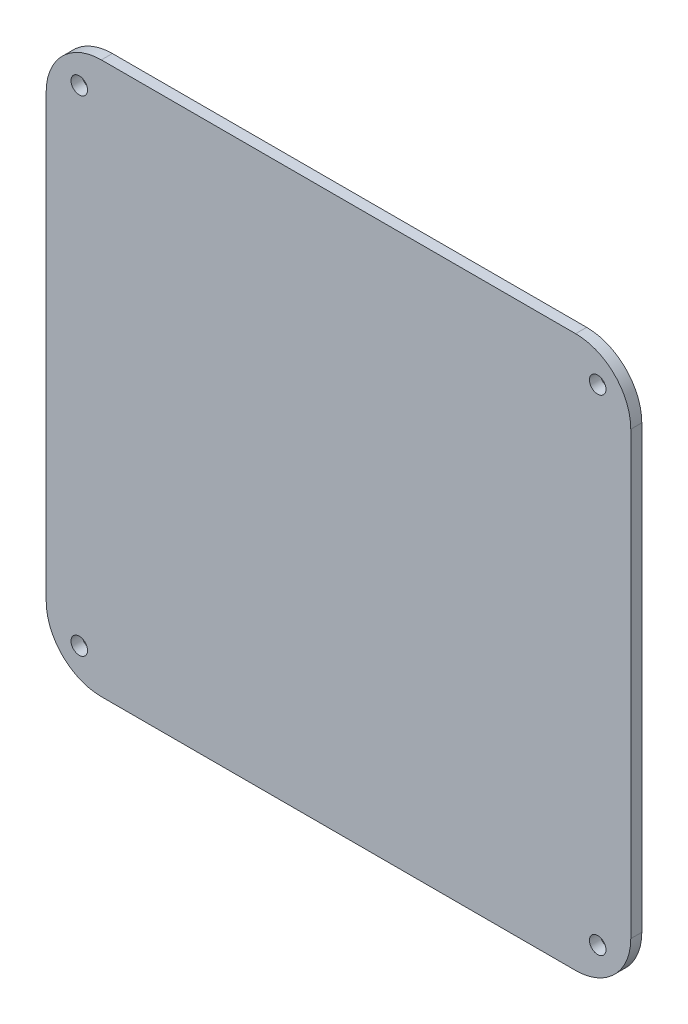
ISO-10303-21;
HEADER;
FILE_DESCRIPTION(('STEP AP214'),'2;1');
FILE_NAME('part.step','',(''),(''),'','','');
FILE_SCHEMA(('AUTOMOTIVE_DESIGN { 1 0 10303 214 1 1 1 1 }'));
ENDSEC;
DATA;
#1=APPLICATION_CONTEXT('core data for automotive mechanical design processes');
#2=APPLICATION_PROTOCOL_DEFINITION('international standard','automotive_design',2000,#1);
#3=PRODUCT_CONTEXT('',#1,'mechanical');
#4=PRODUCT('Part','Part','',(#3));
#5=PRODUCT_RELATED_PRODUCT_CATEGORY('part','',(#4));
#6=PRODUCT_DEFINITION_FORMATION('','',#4);
#7=PRODUCT_DEFINITION_CONTEXT('part definition',#1,'design');
#8=PRODUCT_DEFINITION('design','',#6,#7);
#9=PRODUCT_DEFINITION_SHAPE('','',#8);
#10=(LENGTH_UNIT() NAMED_UNIT(*) SI_UNIT(.MILLI.,.METRE.));
#11=(NAMED_UNIT(*) PLANE_ANGLE_UNIT() SI_UNIT($,.RADIAN.));
#12=(NAMED_UNIT(*) SI_UNIT($,.STERADIAN.) SOLID_ANGLE_UNIT());
#13=UNCERTAINTY_MEASURE_WITH_UNIT(LENGTH_MEASURE(1.E-05),#10,'distance_accuracy_value','');
#14=(GEOMETRIC_REPRESENTATION_CONTEXT(3) GLOBAL_UNCERTAINTY_ASSIGNED_CONTEXT((#13)) GLOBAL_UNIT_ASSIGNED_CONTEXT((#10,
#11,#12)) REPRESENTATION_CONTEXT('',''));
#15=CARTESIAN_POINT('',(0.,0.,0.));
#16=DIRECTION('',(0.,0.,1.));
#17=DIRECTION('',(1.,0.,0.));
#18=AXIS2_PLACEMENT_3D('',#15,#16,#17);
#19=CARTESIAN_POINT('',(-43.0000000000001,270.,-2.));
#20=DIRECTION('',(0.,0.,1.));
#21=DIRECTION('',(1.,0.,0.));
#22=AXIS2_PLACEMENT_3D('',#19,#20,#21);
#23=CYLINDRICAL_SURFACE('',#22,10.);
#24=CARTESIAN_POINT('',(-43.0000000000001,270.,0.));
#25=DIRECTION('',(0.,0.,1.));
#26=DIRECTION('',(1.,0.,0.));
#27=AXIS2_PLACEMENT_3D('',#24,#25,#26);
#28=CIRCLE('',#27,10.);
#29=CARTESIAN_POINT('',(-53.0000000000001,270.,0.));
#30=VERTEX_POINT('',#29);
#31=CARTESIAN_POINT('',(-43.0000000000001,260.,0.));
#32=VERTEX_POINT('',#31);
#33=EDGE_CURVE('E130',#30,#32,#28,.T.);
#34=ORIENTED_EDGE('',*,*,#33,.F.);
#35=DIRECTION('',(0.,0.,1.));
#36=VECTOR('',#35,1.);
#37=CARTESIAN_POINT('',(-53.0000000000001,270.,-2.));
#38=LINE('',#37,#36);
#39=CARTESIAN_POINT('',(-53.0000000000001,270.,-2.));
#40=VERTEX_POINT('',#39);
#41=EDGE_CURVE('E11',#40,#30,#38,.T.);
#42=ORIENTED_EDGE('',*,*,#41,.F.);
#43=CARTESIAN_POINT('',(-43.0000000000001,270.,-2.));
#44=DIRECTION('',(0.,0.,1.));
#45=DIRECTION('',(1.,0.,0.));
#46=AXIS2_PLACEMENT_3D('',#43,#44,#45);
#47=CIRCLE('',#46,10.);
#48=CARTESIAN_POINT('',(-43.0000000000001,260.,-2.));
#49=VERTEX_POINT('',#48);
#50=EDGE_CURVE('E150',#40,#49,#47,.T.);
#51=ORIENTED_EDGE('',*,*,#50,.T.);
#52=DIRECTION('',(0.,0.,1.));
#53=VECTOR('',#52,1.);
#54=CARTESIAN_POINT('',(-43.0000000000001,260.,-2.));
#55=LINE('',#54,#53);
#56=EDGE_CURVE('E88',#49,#32,#55,.T.);
#57=ORIENTED_EDGE('',*,*,#56,.T.);
#58=EDGE_LOOP('',(#34,#42,#51,#57));
#59=FACE_BOUND('',#58,.T.);
#60=ADVANCED_FACE('F32',(#59),#23,.T.);
#61=CARTESIAN_POINT('',(-53.0000000000001,350.,-2.));
#62=DIRECTION('',(-1.,0.,0.));
#63=DIRECTION('',(0.,-1.,0.));
#64=AXIS2_PLACEMENT_3D('',#61,#62,#63);
#65=PLANE('',#64);
#66=DIRECTION('',(0.,-1.,0.));
#67=VECTOR('',#66,1.);
#68=CARTESIAN_POINT('',(-53.0000000000001,350.,0.));
#69=LINE('',#68,#67);
#70=CARTESIAN_POINT('',(-53.0000000000001,350.,0.));
#71=VERTEX_POINT('',#70);
#72=EDGE_CURVE('E148',#71,#30,#69,.T.);
#73=ORIENTED_EDGE('',*,*,#72,.F.);
#74=DIRECTION('',(0.,0.,1.));
#75=VECTOR('',#74,1.);
#76=CARTESIAN_POINT('',(-53.0000000000001,350.,-2.));
#77=LINE('',#76,#75);
#78=CARTESIAN_POINT('',(-53.0000000000001,350.,-2.));
#79=VERTEX_POINT('',#78);
#80=EDGE_CURVE('E41',#79,#71,#77,.T.);
#81=ORIENTED_EDGE('',*,*,#80,.F.);
#82=DIRECTION('',(0.,-1.,0.));
#83=VECTOR('',#82,1.);
#84=CARTESIAN_POINT('',(-53.0000000000001,350.,-2.));
#85=LINE('',#84,#83);
#86=EDGE_CURVE('E120',#79,#40,#85,.T.);
#87=ORIENTED_EDGE('',*,*,#86,.T.);
#88=ORIENTED_EDGE('',*,*,#41,.T.);
#89=EDGE_LOOP('',(#73,#81,#87,#88));
#90=FACE_BOUND('',#89,.T.);
#91=ADVANCED_FACE('F202',(#90),#65,.T.);
#92=CARTESIAN_POINT('',(-43.0000000000001,350.,-2.));
#93=DIRECTION('',(0.,0.,1.));
#94=DIRECTION('',(1.,0.,0.));
#95=AXIS2_PLACEMENT_3D('',#92,#93,#94);
#96=CYLINDRICAL_SURFACE('',#95,10.);
#97=CARTESIAN_POINT('',(-43.0000000000001,350.,0.));
#98=DIRECTION('',(0.,0.,1.));
#99=DIRECTION('',(1.,0.,0.));
#100=AXIS2_PLACEMENT_3D('',#97,#98,#99);
#101=CIRCLE('',#100,10.);
#102=CARTESIAN_POINT('',(-43.0000000000001,360.,0.));
#103=VERTEX_POINT('',#102);
#104=EDGE_CURVE('E107',#103,#71,#101,.T.);
#105=ORIENTED_EDGE('',*,*,#104,.F.);
#106=DIRECTION('',(0.,0.,1.));
#107=VECTOR('',#106,1.);
#108=CARTESIAN_POINT('',(-43.0000000000001,360.,-2.));
#109=LINE('',#108,#107);
#110=CARTESIAN_POINT('',(-43.0000000000001,360.,-2.));
#111=VERTEX_POINT('',#110);
#112=EDGE_CURVE('E102',#111,#103,#109,.T.);
#113=ORIENTED_EDGE('',*,*,#112,.F.);
#114=CARTESIAN_POINT('',(-43.0000000000001,350.,-2.));
#115=DIRECTION('',(0.,0.,1.));
#116=DIRECTION('',(1.,0.,0.));
#117=AXIS2_PLACEMENT_3D('',#114,#115,#116);
#118=CIRCLE('',#117,10.);
#119=EDGE_CURVE('E105',#111,#79,#118,.T.);
#120=ORIENTED_EDGE('',*,*,#119,.T.);
#121=ORIENTED_EDGE('',*,*,#80,.T.);
#122=EDGE_LOOP('',(#105,#113,#120,#121));
#123=FACE_BOUND('',#122,.T.);
#124=ADVANCED_FACE('F104',(#123),#96,.T.);
#125=CARTESIAN_POINT('',(43.,360.,-2.));
#126=DIRECTION('',(0.,1.,0.));
#127=DIRECTION('',(0.,0.,1.));
#128=AXIS2_PLACEMENT_3D('',#125,#126,#127);
#129=PLANE('',#128);
#130=DIRECTION('',(-1.,0.,0.));
#131=VECTOR('',#130,1.);
#132=CARTESIAN_POINT('',(43.,360.,0.));
#133=LINE('',#132,#131);
#134=CARTESIAN_POINT('',(43.,360.,0.));
#135=VERTEX_POINT('',#134);
#136=EDGE_CURVE('E145',#135,#103,#133,.T.);
#137=ORIENTED_EDGE('',*,*,#136,.F.);
#138=DIRECTION('',(0.,0.,1.));
#139=VECTOR('',#138,1.);
#140=CARTESIAN_POINT('',(43.,360.,-2.));
#141=LINE('',#140,#139);
#142=CARTESIAN_POINT('',(43.,360.,-2.));
#143=VERTEX_POINT('',#142);
#144=EDGE_CURVE('E112',#143,#135,#141,.T.);
#145=ORIENTED_EDGE('',*,*,#144,.F.);
#146=DIRECTION('',(-1.,0.,0.));
#147=VECTOR('',#146,1.);
#148=CARTESIAN_POINT('',(43.,360.,-2.));
#149=LINE('',#148,#147);
#150=EDGE_CURVE('E118',#143,#111,#149,.T.);
#151=ORIENTED_EDGE('',*,*,#150,.T.);
#152=ORIENTED_EDGE('',*,*,#112,.T.);
#153=EDGE_LOOP('',(#137,#145,#151,#152));
#154=FACE_BOUND('',#153,.T.);
#155=ADVANCED_FACE('F122',(#154),#129,.T.);
#156=CARTESIAN_POINT('',(43.,350.,-2.));
#157=DIRECTION('',(0.,0.,1.));
#158=DIRECTION('',(1.,0.,0.));
#159=AXIS2_PLACEMENT_3D('',#156,#157,#158);
#160=CYLINDRICAL_SURFACE('',#159,10.);
#161=CARTESIAN_POINT('',(43.,350.,0.));
#162=DIRECTION('',(0.,0.,1.));
#163=DIRECTION('',(1.,0.,0.));
#164=AXIS2_PLACEMENT_3D('',#161,#162,#163);
#165=CIRCLE('',#164,10.);
#166=CARTESIAN_POINT('',(53.,350.,0.));
#167=VERTEX_POINT('',#166);
#168=EDGE_CURVE('E142',#167,#135,#165,.T.);
#169=ORIENTED_EDGE('',*,*,#168,.F.);
#170=DIRECTION('',(0.,0.,1.));
#171=VECTOR('',#170,1.);
#172=CARTESIAN_POINT('',(53.,350.,-2.));
#173=LINE('',#172,#171);
#174=CARTESIAN_POINT('',(53.,350.,-2.));
#175=VERTEX_POINT('',#174);
#176=EDGE_CURVE('E154',#175,#167,#173,.T.);
#177=ORIENTED_EDGE('',*,*,#176,.F.);
#178=CARTESIAN_POINT('',(43.,350.,-2.));
#179=DIRECTION('',(0.,0.,1.));
#180=DIRECTION('',(1.,0.,0.));
#181=AXIS2_PLACEMENT_3D('',#178,#179,#180);
#182=CIRCLE('',#181,10.);
#183=EDGE_CURVE('E123',#175,#143,#182,.T.);
#184=ORIENTED_EDGE('',*,*,#183,.T.);
#185=ORIENTED_EDGE('',*,*,#144,.T.);
#186=EDGE_LOOP('',(#169,#177,#184,#185));
#187=FACE_BOUND('',#186,.T.);
#188=ADVANCED_FACE('F201',(#187),#160,.T.);
#189=CARTESIAN_POINT('',(53.,270.,-2.));
#190=DIRECTION('',(1.,0.,0.));
#191=DIRECTION('',(0.,1.,0.));
#192=AXIS2_PLACEMENT_3D('',#189,#190,#191);
#193=PLANE('',#192);
#194=DIRECTION('',(0.,1.,0.));
#195=VECTOR('',#194,1.);
#196=CARTESIAN_POINT('',(53.,270.,0.));
#197=LINE('',#196,#195);
#198=CARTESIAN_POINT('',(53.,270.,0.));
#199=VERTEX_POINT('',#198);
#200=EDGE_CURVE('E139',#199,#167,#197,.T.);
#201=ORIENTED_EDGE('',*,*,#200,.F.);
#202=DIRECTION('',(0.,0.,1.));
#203=VECTOR('',#202,1.);
#204=CARTESIAN_POINT('',(53.,270.,-2.));
#205=LINE('',#204,#203);
#206=CARTESIAN_POINT('',(53.,270.,-2.));
#207=VERTEX_POINT('',#206);
#208=EDGE_CURVE('E156',#207,#199,#205,.T.);
#209=ORIENTED_EDGE('',*,*,#208,.F.);
#210=DIRECTION('',(0.,1.,0.));
#211=VECTOR('',#210,1.);
#212=CARTESIAN_POINT('',(53.,270.,-2.));
#213=LINE('',#212,#211);
#214=EDGE_CURVE('E125',#207,#175,#213,.T.);
#215=ORIENTED_EDGE('',*,*,#214,.T.);
#216=ORIENTED_EDGE('',*,*,#176,.T.);
#217=EDGE_LOOP('',(#201,#209,#215,#216));
#218=FACE_BOUND('',#217,.T.);
#219=ADVANCED_FACE('F197',(#218),#193,.T.);
#220=CARTESIAN_POINT('',(43.,270.,-2.));
#221=DIRECTION('',(0.,0.,1.));
#222=DIRECTION('',(1.,0.,0.));
#223=AXIS2_PLACEMENT_3D('',#220,#221,#222);
#224=CYLINDRICAL_SURFACE('',#223,10.);
#225=CARTESIAN_POINT('',(43.,270.,0.));
#226=DIRECTION('',(0.,0.,1.));
#227=DIRECTION('',(1.,0.,0.));
#228=AXIS2_PLACEMENT_3D('',#225,#226,#227);
#229=CIRCLE('',#228,10.);
#230=CARTESIAN_POINT('',(43.,260.,0.));
#231=VERTEX_POINT('',#230);
#232=EDGE_CURVE('E136',#231,#199,#229,.T.);
#233=ORIENTED_EDGE('',*,*,#232,.F.);
#234=DIRECTION('',(0.,0.,1.));
#235=VECTOR('',#234,1.);
#236=CARTESIAN_POINT('',(43.,260.,-2.));
#237=LINE('',#236,#235);
#238=CARTESIAN_POINT('',(43.,260.,-2.));
#239=VERTEX_POINT('',#238);
#240=EDGE_CURVE('E158',#239,#231,#237,.T.);
#241=ORIENTED_EDGE('',*,*,#240,.F.);
#242=CARTESIAN_POINT('',(43.,270.,-2.));
#243=DIRECTION('',(0.,0.,1.));
#244=DIRECTION('',(1.,0.,0.));
#245=AXIS2_PLACEMENT_3D('',#242,#243,#244);
#246=CIRCLE('',#245,10.);
#247=EDGE_CURVE('E259',#239,#207,#246,.T.);
#248=ORIENTED_EDGE('',*,*,#247,.T.);
#249=ORIENTED_EDGE('',*,*,#208,.T.);
#250=EDGE_LOOP('',(#233,#241,#248,#249));
#251=FACE_BOUND('',#250,.T.);
#252=ADVANCED_FACE('F193',(#251),#224,.T.);
#253=CARTESIAN_POINT('',(-43.0000000000001,260.,-2.));
#254=DIRECTION('',(0.,-1.,0.));
#255=DIRECTION('',(0.,0.,-1.));
#256=AXIS2_PLACEMENT_3D('',#253,#254,#255);
#257=PLANE('',#256);
#258=DIRECTION('',(1.,0.,0.));
#259=VECTOR('',#258,1.);
#260=CARTESIAN_POINT('',(-43.0000000000001,260.,0.));
#261=LINE('',#260,#259);
#262=EDGE_CURVE('E133',#32,#231,#261,.T.);
#263=ORIENTED_EDGE('',*,*,#262,.F.);
#264=ORIENTED_EDGE('',*,*,#56,.F.);
#265=DIRECTION('',(1.,0.,0.));
#266=VECTOR('',#265,1.);
#267=CARTESIAN_POINT('',(-43.0000000000001,260.,-2.));
#268=LINE('',#267,#266);
#269=EDGE_CURVE('E189',#49,#239,#268,.T.);
#270=ORIENTED_EDGE('',*,*,#269,.T.);
#271=ORIENTED_EDGE('',*,*,#240,.T.);
#272=EDGE_LOOP('',(#263,#264,#270,#271));
#273=FACE_BOUND('',#272,.T.);
#274=ADVANCED_FACE('F187',(#273),#257,.T.);
#275=CARTESIAN_POINT('',(-43.0000000000001,270.,-2.));
#276=DIRECTION('',(0.,0.,1.));
#277=DIRECTION('',(1.,0.,0.));
#278=AXIS2_PLACEMENT_3D('',#275,#276,#277);
#279=PLANE('',#278);
#280=CARTESIAN_POINT('',(47.,266.,-2.));
#281=DIRECTION('',(0.,0.,-1.));
#282=DIRECTION('',(-1.,0.,0.));
#283=AXIS2_PLACEMENT_3D('',#280,#281,#282);
#284=CIRCLE('',#283,1.5);
#285=CARTESIAN_POINT('',(45.5,266.,-2.));
#286=VERTEX_POINT('',#285);
#287=EDGE_CURVE('E252',#286,#286,#284,.T.);
#288=ORIENTED_EDGE('',*,*,#287,.F.);
#289=EDGE_LOOP('',(#288));
#290=FACE_BOUND('',#289,.T.);
#291=CARTESIAN_POINT('',(47.,354.,-2.));
#292=DIRECTION('',(0.,0.,-1.));
#293=DIRECTION('',(-1.,0.,0.));
#294=AXIS2_PLACEMENT_3D('',#291,#292,#293);
#295=CIRCLE('',#294,1.5);
#296=CARTESIAN_POINT('',(45.5,354.,-2.));
#297=VERTEX_POINT('',#296);
#298=EDGE_CURVE('E247',#297,#297,#295,.T.);
#299=ORIENTED_EDGE('',*,*,#298,.F.);
#300=EDGE_LOOP('',(#299));
#301=FACE_BOUND('',#300,.T.);
#302=CARTESIAN_POINT('',(-47.0000000000002,354.,-2.));
#303=DIRECTION('',(0.,0.,-1.));
#304=DIRECTION('',(-1.,0.,0.));
#305=AXIS2_PLACEMENT_3D('',#302,#303,#304);
#306=CIRCLE('',#305,1.5);
#307=CARTESIAN_POINT('',(-48.5000000000002,354.,-2.));
#308=VERTEX_POINT('',#307);
#309=EDGE_CURVE('E245',#308,#308,#306,.T.);
#310=ORIENTED_EDGE('',*,*,#309,.F.);
#311=EDGE_LOOP('',(#310));
#312=FACE_BOUND('',#311,.T.);
#313=CARTESIAN_POINT('',(-47.,266.,-2.));
#314=DIRECTION('',(0.,0.,-1.));
#315=DIRECTION('',(-1.,0.,0.));
#316=AXIS2_PLACEMENT_3D('',#313,#314,#315);
#317=CIRCLE('',#316,1.5);
#318=CARTESIAN_POINT('',(-48.5,266.,-2.));
#319=VERTEX_POINT('',#318);
#320=EDGE_CURVE('E165',#319,#319,#317,.T.);
#321=ORIENTED_EDGE('',*,*,#320,.F.);
#322=EDGE_LOOP('',(#321));
#323=FACE_BOUND('',#322,.T.);
#324=ORIENTED_EDGE('',*,*,#50,.F.);
#325=ORIENTED_EDGE('',*,*,#86,.F.);
#326=ORIENTED_EDGE('',*,*,#119,.F.);
#327=ORIENTED_EDGE('',*,*,#150,.F.);
#328=ORIENTED_EDGE('',*,*,#183,.F.);
#329=ORIENTED_EDGE('',*,*,#214,.F.);
#330=ORIENTED_EDGE('',*,*,#247,.F.);
#331=ORIENTED_EDGE('',*,*,#269,.F.);
#332=EDGE_LOOP('',(#324,#325,#326,#327,#328,#329,#330,#331));
#333=FACE_BOUND('',#332,.T.);
#334=ADVANCED_FACE('F116',(#290,#301,#312,#323,#333),#279,.F.);
#335=CARTESIAN_POINT('',(-43.0000000000001,270.,0.));
#336=DIRECTION('',(0.,0.,1.));
#337=DIRECTION('',(1.,0.,0.));
#338=AXIS2_PLACEMENT_3D('',#335,#336,#337);
#339=PLANE('',#338);
#340=CARTESIAN_POINT('',(47.,266.,0.));
#341=DIRECTION('',(0.,0.,1.));
#342=DIRECTION('',(1.,0.,0.));
#343=AXIS2_PLACEMENT_3D('',#340,#341,#342);
#344=CIRCLE('',#343,1.5);
#345=CARTESIAN_POINT('',(48.5,266.,0.));
#346=VERTEX_POINT('',#345);
#347=EDGE_CURVE('E35',#346,#346,#344,.T.);
#348=ORIENTED_EDGE('',*,*,#347,.F.);
#349=EDGE_LOOP('',(#348));
#350=FACE_BOUND('',#349,.T.);
#351=CARTESIAN_POINT('',(47.,354.,0.));
#352=DIRECTION('',(0.,0.,1.));
#353=DIRECTION('',(1.,0.,0.));
#354=AXIS2_PLACEMENT_3D('',#351,#352,#353);
#355=CIRCLE('',#354,1.5);
#356=CARTESIAN_POINT('',(48.5,354.,0.));
#357=VERTEX_POINT('',#356);
#358=EDGE_CURVE('E167',#357,#357,#355,.T.);
#359=ORIENTED_EDGE('',*,*,#358,.F.);
#360=EDGE_LOOP('',(#359));
#361=FACE_BOUND('',#360,.T.);
#362=CARTESIAN_POINT('',(-47.0000000000002,354.,0.));
#363=DIRECTION('',(0.,0.,1.));
#364=DIRECTION('',(1.,0.,0.));
#365=AXIS2_PLACEMENT_3D('',#362,#363,#364);
#366=CIRCLE('',#365,1.5);
#367=CARTESIAN_POINT('',(-45.5000000000002,354.,0.));
#368=VERTEX_POINT('',#367);
#369=EDGE_CURVE('E164',#368,#368,#366,.T.);
#370=ORIENTED_EDGE('',*,*,#369,.F.);
#371=EDGE_LOOP('',(#370));
#372=FACE_BOUND('',#371,.T.);
#373=CARTESIAN_POINT('',(-47.,266.,0.));
#374=DIRECTION('',(0.,0.,1.));
#375=DIRECTION('',(1.,0.,0.));
#376=AXIS2_PLACEMENT_3D('',#373,#374,#375);
#377=CIRCLE('',#376,1.5);
#378=CARTESIAN_POINT('',(-45.5,266.,0.));
#379=VERTEX_POINT('',#378);
#380=EDGE_CURVE('E161',#379,#379,#377,.T.);
#381=ORIENTED_EDGE('',*,*,#380,.F.);
#382=EDGE_LOOP('',(#381));
#383=FACE_BOUND('',#382,.T.);
#384=ORIENTED_EDGE('',*,*,#33,.T.);
#385=ORIENTED_EDGE('',*,*,#262,.T.);
#386=ORIENTED_EDGE('',*,*,#232,.T.);
#387=ORIENTED_EDGE('',*,*,#200,.T.);
#388=ORIENTED_EDGE('',*,*,#168,.T.);
#389=ORIENTED_EDGE('',*,*,#136,.T.);
#390=ORIENTED_EDGE('',*,*,#104,.T.);
#391=ORIENTED_EDGE('',*,*,#72,.T.);
#392=EDGE_LOOP('',(#384,#385,#386,#387,#388,#389,#390,#391));
#393=FACE_BOUND('',#392,.T.);
#394=ADVANCED_FACE('F177',(#350,#361,#372,#383,#393),#339,.T.);
#395=CARTESIAN_POINT('',(-47.,266.,1.));
#396=DIRECTION('',(0.,0.,-1.));
#397=DIRECTION('',(-1.,0.,0.));
#398=AXIS2_PLACEMENT_3D('',#395,#396,#397);
#399=CYLINDRICAL_SURFACE('',#398,1.5);
#400=ORIENTED_EDGE('',*,*,#380,.T.);
#401=EDGE_LOOP('',(#400));
#402=FACE_BOUND('',#401,.T.);
#403=ORIENTED_EDGE('',*,*,#320,.T.);
#404=EDGE_LOOP('',(#403));
#405=FACE_BOUND('',#404,.T.);
#406=ADVANCED_FACE('F180',(#402,#405),#399,.F.);
#407=CARTESIAN_POINT('',(-47.0000000000002,354.,1.));
#408=DIRECTION('',(0.,0.,-1.));
#409=DIRECTION('',(-1.,0.,0.));
#410=AXIS2_PLACEMENT_3D('',#407,#408,#409);
#411=CYLINDRICAL_SURFACE('',#410,1.5);
#412=ORIENTED_EDGE('',*,*,#369,.T.);
#413=EDGE_LOOP('',(#412));
#414=FACE_BOUND('',#413,.T.);
#415=ORIENTED_EDGE('',*,*,#309,.T.);
#416=EDGE_LOOP('',(#415));
#417=FACE_BOUND('',#416,.T.);
#418=ADVANCED_FACE('F231',(#414,#417),#411,.F.);
#419=CARTESIAN_POINT('',(47.,354.,1.));
#420=DIRECTION('',(0.,0.,-1.));
#421=DIRECTION('',(-1.,0.,0.));
#422=AXIS2_PLACEMENT_3D('',#419,#420,#421);
#423=CYLINDRICAL_SURFACE('',#422,1.5);
#424=ORIENTED_EDGE('',*,*,#358,.T.);
#425=EDGE_LOOP('',(#424));
#426=FACE_BOUND('',#425,.T.);
#427=ORIENTED_EDGE('',*,*,#298,.T.);
#428=EDGE_LOOP('',(#427));
#429=FACE_BOUND('',#428,.T.);
#430=ADVANCED_FACE('F235',(#426,#429),#423,.F.);
#431=CARTESIAN_POINT('',(47.,266.,1.));
#432=DIRECTION('',(0.,0.,-1.));
#433=DIRECTION('',(-1.,0.,0.));
#434=AXIS2_PLACEMENT_3D('',#431,#432,#433);
#435=CYLINDRICAL_SURFACE('',#434,1.5);
#436=ORIENTED_EDGE('',*,*,#347,.T.);
#437=EDGE_LOOP('',(#436));
#438=FACE_BOUND('',#437,.T.);
#439=ORIENTED_EDGE('',*,*,#287,.T.);
#440=EDGE_LOOP('',(#439));
#441=FACE_BOUND('',#440,.T.);
#442=ADVANCED_FACE('F174',(#438,#441),#435,.F.);
#443=CLOSED_SHELL('',(#60,#91,#124,#155,#188,#219,#252,#274,#334,#394,#406,#418,#430,#442));
#444=MANIFOLD_SOLID_BREP('B2',#443);
#445=ADVANCED_BREP_SHAPE_REPRESENTATION('',(#18,#444),#14);
#446=SHAPE_DEFINITION_REPRESENTATION(#9,#445);
ENDSEC;
END-ISO-10303-21;
